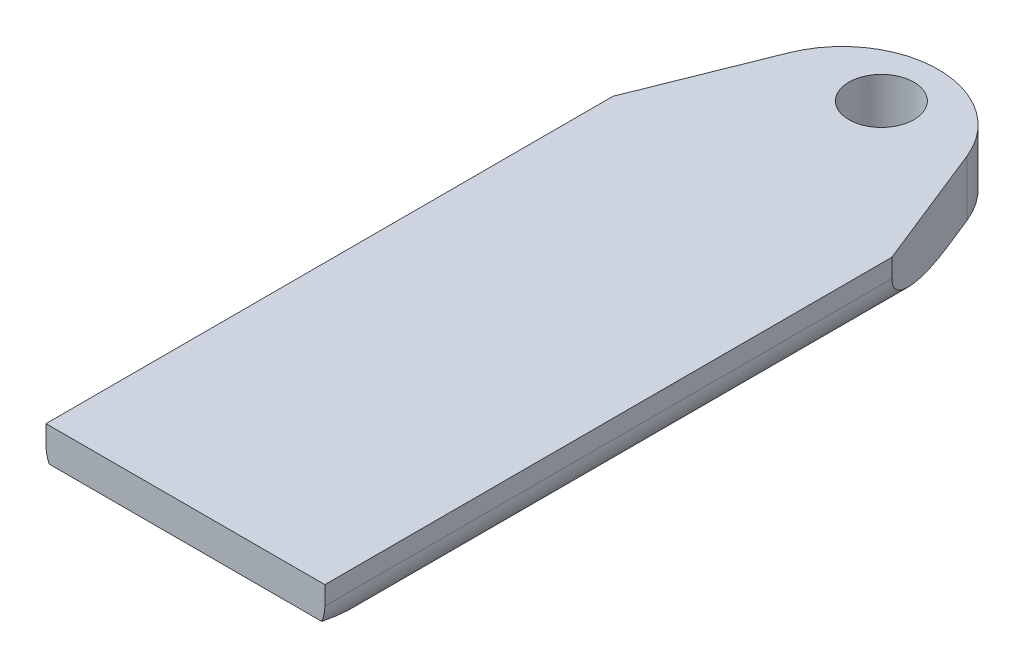
ISO-10303-21;
HEADER;
FILE_DESCRIPTION(('STEP AP214'),'2;1');
FILE_NAME('part.step','',(''),(''),'','','');
FILE_SCHEMA(('AUTOMOTIVE_DESIGN { 1 0 10303 214 1 1 1 1 }'));
ENDSEC;
DATA;
#1=APPLICATION_CONTEXT('core data for automotive mechanical design processes');
#2=APPLICATION_PROTOCOL_DEFINITION('international standard','automotive_design',2000,#1);
#3=PRODUCT_CONTEXT('',#1,'mechanical');
#4=PRODUCT('Part','Part','',(#3));
#5=PRODUCT_RELATED_PRODUCT_CATEGORY('part','',(#4));
#6=PRODUCT_DEFINITION_FORMATION('','',#4);
#7=PRODUCT_DEFINITION_CONTEXT('part definition',#1,'design');
#8=PRODUCT_DEFINITION('design','',#6,#7);
#9=PRODUCT_DEFINITION_SHAPE('','',#8);
#10=(LENGTH_UNIT() NAMED_UNIT(*) SI_UNIT(.MILLI.,.METRE.));
#11=(NAMED_UNIT(*) PLANE_ANGLE_UNIT() SI_UNIT($,.RADIAN.));
#12=(NAMED_UNIT(*) SI_UNIT($,.STERADIAN.) SOLID_ANGLE_UNIT());
#13=UNCERTAINTY_MEASURE_WITH_UNIT(LENGTH_MEASURE(1.E-05),#10,'distance_accuracy_value','');
#14=(GEOMETRIC_REPRESENTATION_CONTEXT(3) GLOBAL_UNCERTAINTY_ASSIGNED_CONTEXT((#13)) GLOBAL_UNIT_ASSIGNED_CONTEXT((#10,
#11,#12)) REPRESENTATION_CONTEXT('',''));
#15=CARTESIAN_POINT('',(0.,0.,0.));
#16=DIRECTION('',(0.,0.,1.));
#17=DIRECTION('',(1.,0.,0.));
#18=AXIS2_PLACEMENT_3D('',#15,#16,#17);
#19=CARTESIAN_POINT('',(0.,110.,-35.3303846350059));
#20=DIRECTION('',(0.,1.,0.));
#21=DIRECTION('',(0.,0.,1.));
#22=AXIS2_PLACEMENT_3D('',#19,#20,#21);
#23=CYLINDRICAL_SURFACE('',#22,5.16961536499412);
#24=DIRECTION('',(0.,-1.,0.));
#25=VECTOR('',#24,1.);
#26=CARTESIAN_POINT('',(-4.79986736723934,107.,-37.2503315819016));
#27=LINE('',#26,#25);
#28=CARTESIAN_POINT('',(-4.79986736723934,110.,-37.2503315819016));
#29=VERTEX_POINT('',#28);
#30=CARTESIAN_POINT('',(-4.79986736723934,107.,-37.2503315819016));
#31=VERTEX_POINT('',#30);
#32=EDGE_CURVE('E176',#29,#31,#27,.T.);
#33=ORIENTED_EDGE('',*,*,#32,.F.);
#34=CARTESIAN_POINT('',(0.,110.,-35.3303846350059));
#35=DIRECTION('',(0.,1.,0.));
#36=DIRECTION('',(0.,0.,1.));
#37=AXIS2_PLACEMENT_3D('',#34,#35,#36);
#38=CIRCLE('',#37,5.16961536499412);
#39=CARTESIAN_POINT('',(4.79986736723935,110.,-37.2503315819016));
#40=VERTEX_POINT('',#39);
#41=EDGE_CURVE('E47',#40,#29,#38,.T.);
#42=ORIENTED_EDGE('',*,*,#41,.F.);
#43=DIRECTION('',(0.,-1.,0.));
#44=VECTOR('',#43,1.);
#45=CARTESIAN_POINT('',(4.79986736723935,107.,-37.2503315819016));
#46=LINE('',#45,#44);
#47=CARTESIAN_POINT('',(4.79986736723935,107.,-37.2503315819016));
#48=VERTEX_POINT('',#47);
#49=EDGE_CURVE('E179',#48,#40,#46,.F.);
#50=ORIENTED_EDGE('',*,*,#49,.F.);
#51=CARTESIAN_POINT('',(0.,107.,-35.3303846350059));
#52=DIRECTION('',(0.,-1.,0.));
#53=DIRECTION('',(0.,0.,-1.));
#54=AXIS2_PLACEMENT_3D('',#51,#52,#53);
#55=CIRCLE('',#54,5.16961536499412);
#56=EDGE_CURVE('E13',#31,#48,#55,.T.);
#57=ORIENTED_EDGE('',*,*,#56,.F.);
#58=EDGE_LOOP('',(#33,#42,#50,#57));
#59=FACE_BOUND('',#58,.T.);
#60=ADVANCED_FACE('F39',(#59),#23,.T.);
#61=CARTESIAN_POINT('',(-7.49999999999999,107.,-40.5));
#62=DIRECTION('',(-1.,0.,0.));
#63=DIRECTION('',(0.,0.,1.));
#64=AXIS2_PLACEMENT_3D('',#61,#62,#63);
#65=PLANE('',#64);
#66=DIRECTION('',(0.,-1.,0.));
#67=VECTOR('',#66,1.);
#68=CARTESIAN_POINT('',(-7.49999999999999,107.,-30.4999999999999));
#69=LINE('',#68,#67);
#70=CARTESIAN_POINT('',(-7.49999999999999,110.,-30.4999999999999));
#71=VERTEX_POINT('',#70);
#72=CARTESIAN_POINT('',(-7.49999999999999,109.,-30.4999999999999));
#73=VERTEX_POINT('',#72);
#74=EDGE_CURVE('E142',#71,#73,#69,.T.);
#75=ORIENTED_EDGE('',*,*,#74,.T.);
#76=DIRECTION('',(0.,0.,1.));
#77=VECTOR('',#76,1.);
#78=CARTESIAN_POINT('',(-7.49999999999999,109.,-40.5));
#79=LINE('',#78,#77);
#80=CARTESIAN_POINT('',(-7.49999999999999,109.,0.));
#81=VERTEX_POINT('',#80);
#82=EDGE_CURVE('E154',#73,#81,#79,.T.);
#83=ORIENTED_EDGE('',*,*,#82,.T.);
#84=DIRECTION('',(0.,-1.,0.));
#85=VECTOR('',#84,1.);
#86=CARTESIAN_POINT('',(-7.49999999999999,107.,0.));
#87=LINE('',#86,#85);
#88=CARTESIAN_POINT('',(-7.49999999999999,110.,0.));
#89=VERTEX_POINT('',#88);
#90=EDGE_CURVE('E118',#89,#81,#87,.T.);
#91=ORIENTED_EDGE('',*,*,#90,.F.);
#92=DIRECTION('',(0.,0.,1.));
#93=VECTOR('',#92,1.);
#94=CARTESIAN_POINT('',(-7.49999999999999,110.,-40.5));
#95=LINE('',#94,#93);
#96=EDGE_CURVE('E128',#71,#89,#95,.T.);
#97=ORIENTED_EDGE('',*,*,#96,.F.);
#98=EDGE_LOOP('',(#75,#83,#91,#97));
#99=FACE_BOUND('',#98,.T.);
#100=ADVANCED_FACE('F188',(#99),#65,.T.);
#101=CARTESIAN_POINT('',(-7.49999999999999,110.,-40.5));
#102=DIRECTION('',(0.,1.,0.));
#103=DIRECTION('',(0.,0.,1.));
#104=AXIS2_PLACEMENT_3D('',#101,#102,#103);
#105=PLANE('',#104);
#106=CARTESIAN_POINT('',(-0.0655498861733732,110.,-37.5));
#107=DIRECTION('',(0.,1.,0.));
#108=DIRECTION('',(0.,0.,1.));
#109=AXIS2_PLACEMENT_3D('',#106,#107,#108);
#110=CIRCLE('',#109,1.75);
#111=CARTESIAN_POINT('',(-0.0655498861733732,110.,-35.75));
#112=VERTEX_POINT('',#111);
#113=EDGE_CURVE('E249',#112,#112,#110,.T.);
#114=ORIENTED_EDGE('',*,*,#113,.F.);
#115=EDGE_LOOP('',(#114));
#116=FACE_BOUND('',#115,.T.);
#117=DIRECTION('',(0.371390676354101,0.,0.92847669088526));
#118=VECTOR('',#117,1.);
#119=CARTESIAN_POINT('',(1.98275862068967,110.,-44.2931034482758));
#120=LINE('',#119,#118);
#121=CARTESIAN_POINT('',(7.50000000000001,110.,-30.4999999999999));
#122=VERTEX_POINT('',#121);
#123=EDGE_CURVE('E149',#122,#40,#120,.F.);
#124=ORIENTED_EDGE('',*,*,#123,.T.);
#125=ORIENTED_EDGE('',*,*,#41,.T.);
#126=DIRECTION('',(0.371390676354101,0.,-0.92847669088526));
#127=VECTOR('',#126,1.);
#128=CARTESIAN_POINT('',(-4.05172413793102,110.,-39.1206896551724));
#129=LINE('',#128,#127);
#130=EDGE_CURVE('E151',#29,#71,#129,.F.);
#131=ORIENTED_EDGE('',*,*,#130,.T.);
#132=ORIENTED_EDGE('',*,*,#96,.T.);
#133=DIRECTION('',(-1.,0.,0.));
#134=VECTOR('',#133,1.);
#135=CARTESIAN_POINT('',(-7.49999999999999,110.,0.));
#136=LINE('',#135,#134);
#137=CARTESIAN_POINT('',(7.50000000000001,110.,0.));
#138=VERTEX_POINT('',#137);
#139=EDGE_CURVE('E112',#138,#89,#136,.T.);
#140=ORIENTED_EDGE('',*,*,#139,.F.);
#141=DIRECTION('',(0.,0.,1.));
#142=VECTOR('',#141,1.);
#143=CARTESIAN_POINT('',(7.50000000000001,110.,-40.5));
#144=LINE('',#143,#142);
#145=EDGE_CURVE('E121',#122,#138,#144,.T.);
#146=ORIENTED_EDGE('',*,*,#145,.F.);
#147=EDGE_LOOP('',(#124,#125,#131,#132,#140,#146));
#148=FACE_BOUND('',#147,.T.);
#149=ADVANCED_FACE('F130',(#116,#148),#105,.T.);
#150=CARTESIAN_POINT('',(7.50000000000001,107.,-40.5));
#151=DIRECTION('',(1.,0.,0.));
#152=DIRECTION('',(0.,0.,-1.));
#153=AXIS2_PLACEMENT_3D('',#150,#151,#152);
#154=PLANE('',#153);
#155=DIRECTION('',(0.,1.,0.));
#156=VECTOR('',#155,1.);
#157=CARTESIAN_POINT('',(7.50000000000001,107.,0.));
#158=LINE('',#157,#156);
#159=CARTESIAN_POINT('',(7.50000000000001,109.,0.));
#160=VERTEX_POINT('',#159);
#161=EDGE_CURVE('E107',#160,#138,#158,.T.);
#162=ORIENTED_EDGE('',*,*,#161,.F.);
#163=DIRECTION('',(0.,0.,1.));
#164=VECTOR('',#163,1.);
#165=CARTESIAN_POINT('',(7.50000000000001,109.,-40.5));
#166=LINE('',#165,#164);
#167=CARTESIAN_POINT('',(7.50000000000001,109.,-30.4999999999999));
#168=VERTEX_POINT('',#167);
#169=EDGE_CURVE('E171',#160,#168,#166,.F.);
#170=ORIENTED_EDGE('',*,*,#169,.T.);
#171=DIRECTION('',(0.,1.,0.));
#172=VECTOR('',#171,1.);
#173=CARTESIAN_POINT('',(7.50000000000001,107.,-30.4999999999999));
#174=LINE('',#173,#172);
#175=EDGE_CURVE('E124',#168,#122,#174,.T.);
#176=ORIENTED_EDGE('',*,*,#175,.T.);
#177=ORIENTED_EDGE('',*,*,#145,.T.);
#178=EDGE_LOOP('',(#162,#170,#176,#177));
#179=FACE_BOUND('',#178,.T.);
#180=ADVANCED_FACE('F122',(#179),#154,.T.);
#181=CARTESIAN_POINT('',(-7.49999999999999,107.,-40.5));
#182=DIRECTION('',(0.,-1.,0.));
#183=DIRECTION('',(0.,0.,-1.));
#184=AXIS2_PLACEMENT_3D('',#181,#182,#183);
#185=PLANE('',#184);
#186=CARTESIAN_POINT('',(-0.0655498861733732,107.,-37.5));
#187=DIRECTION('',(0.,-1.,0.));
#188=DIRECTION('',(0.,0.,-1.));
#189=AXIS2_PLACEMENT_3D('',#186,#187,#188);
#190=CIRCLE('',#189,1.75);
#191=CARTESIAN_POINT('',(-0.0655498861733732,107.,-39.25));
#192=VERTEX_POINT('',#191);
#193=EDGE_CURVE('E248',#192,#192,#190,.T.);
#194=ORIENTED_EDGE('',*,*,#193,.F.);
#195=EDGE_LOOP('',(#194));
#196=FACE_BOUND('',#195,.T.);
#197=DIRECTION('',(-0.371390676354101,0.,0.92847669088526));
#198=VECTOR('',#197,1.);
#199=CARTESIAN_POINT('',(-4.05172413793102,107.,-39.1206896551724));
#200=LINE('',#199,#198);
#201=CARTESIAN_POINT('',(-5.49999999999999,107.,-35.4999999999999));
#202=VERTEX_POINT('',#201);
#203=EDGE_CURVE('E147',#202,#31,#200,.F.);
#204=ORIENTED_EDGE('',*,*,#203,.T.);
#205=ORIENTED_EDGE('',*,*,#56,.T.);
#206=DIRECTION('',(-0.371390676354101,0.,-0.92847669088526));
#207=VECTOR('',#206,1.);
#208=CARTESIAN_POINT('',(1.98275862068967,107.,-44.2931034482758));
#209=LINE('',#208,#207);
#210=CARTESIAN_POINT('',(5.50000000000001,107.,-35.5));
#211=VERTEX_POINT('',#210);
#212=EDGE_CURVE('E145',#48,#211,#209,.F.);
#213=ORIENTED_EDGE('',*,*,#212,.T.);
#214=DIRECTION('',(0.,0.,1.));
#215=VECTOR('',#214,1.);
#216=CARTESIAN_POINT('',(5.50000000000001,107.,-40.5));
#217=LINE('',#216,#215);
#218=CARTESIAN_POINT('',(5.50000000000001,107.,-4.00000000000004));
#219=VERTEX_POINT('',#218);
#220=EDGE_CURVE('E164',#211,#219,#217,.T.);
#221=ORIENTED_EDGE('',*,*,#220,.T.);
#222=DIRECTION('',(-1.,0.,0.));
#223=VECTOR('',#222,1.);
#224=CARTESIAN_POINT('',(-7.49999999999999,107.,-4.00000000000004));
#225=LINE('',#224,#223);
#226=CARTESIAN_POINT('',(-5.49999999999999,107.,-4.00000000000004));
#227=VERTEX_POINT('',#226);
#228=EDGE_CURVE('E139',#219,#227,#225,.T.);
#229=ORIENTED_EDGE('',*,*,#228,.T.);
#230=DIRECTION('',(0.,0.,1.));
#231=VECTOR('',#230,1.);
#232=CARTESIAN_POINT('',(-5.49999999999999,107.,-40.5));
#233=LINE('',#232,#231);
#234=EDGE_CURVE('E167',#227,#202,#233,.F.);
#235=ORIENTED_EDGE('',*,*,#234,.T.);
#236=EDGE_LOOP('',(#204,#205,#213,#221,#229,#235));
#237=FACE_BOUND('',#236,.T.);
#238=ADVANCED_FACE('F201',(#196,#237),#185,.T.);
#239=CARTESIAN_POINT('',(0.,0.,0.));
#240=DIRECTION('',(0.,0.,-1.));
#241=DIRECTION('',(-1.,0.,0.));
#242=AXIS2_PLACEMENT_3D('',#239,#240,#241);
#243=PLANE('',#242);
#244=ORIENTED_EDGE('',*,*,#90,.T.);
#245=CARTESIAN_POINT('',(-5.49999999999999,109.,0.));
#246=DIRECTION('',(0.,0.,-1.));
#247=DIRECTION('',(-1.,0.,0.));
#248=AXIS2_PLACEMENT_3D('',#245,#246,#247);
#249=CIRCLE('',#248,2.);
#250=CARTESIAN_POINT('',(-7.33303027798233,108.2,0.));
#251=VERTEX_POINT('',#250);
#252=EDGE_CURVE('E158',#81,#251,#249,.F.);
#253=ORIENTED_EDGE('',*,*,#252,.T.);
#254=DIRECTION('',(1.,0.,0.));
#255=VECTOR('',#254,1.);
#256=CARTESIAN_POINT('',(7.50000000000001,108.2,0.));
#257=LINE('',#256,#255);
#258=CARTESIAN_POINT('',(7.33303027798234,108.2,0.));
#259=VERTEX_POINT('',#258);
#260=EDGE_CURVE('E136',#251,#259,#257,.T.);
#261=ORIENTED_EDGE('',*,*,#260,.T.);
#262=CARTESIAN_POINT('',(5.50000000000001,109.,0.));
#263=DIRECTION('',(0.,0.,-1.));
#264=DIRECTION('',(-1.,0.,0.));
#265=AXIS2_PLACEMENT_3D('',#262,#263,#264);
#266=CIRCLE('',#265,2.);
#267=EDGE_CURVE('E115',#259,#160,#266,.F.);
#268=ORIENTED_EDGE('',*,*,#267,.T.);
#269=ORIENTED_EDGE('',*,*,#161,.T.);
#270=ORIENTED_EDGE('',*,*,#139,.T.);
#271=EDGE_LOOP('',(#244,#253,#261,#268,#269,#270));
#272=FACE_BOUND('',#271,.T.);
#273=ADVANCED_FACE('F110',(#272),#243,.F.);
#274=CARTESIAN_POINT('',(-0.0655498861733732,147.5,-37.5));
#275=DIRECTION('',(0.,-1.,0.));
#276=DIRECTION('',(0.,0.,-1.));
#277=AXIS2_PLACEMENT_3D('',#274,#275,#276);
#278=CYLINDRICAL_SURFACE('',#277,1.75);
#279=ORIENTED_EDGE('',*,*,#113,.T.);
#280=EDGE_LOOP('',(#279));
#281=FACE_BOUND('',#280,.T.);
#282=ORIENTED_EDGE('',*,*,#193,.T.);
#283=EDGE_LOOP('',(#282));
#284=FACE_BOUND('',#283,.T.);
#285=ADVANCED_FACE('F227',(#281,#284),#278,.F.);
#286=CARTESIAN_POINT('',(0.,108.2,0.));
#287=DIRECTION('',(0.,-0.957826285221152,0.287347885566344));
#288=DIRECTION('',(-1.,0.,0.));
#289=AXIS2_PLACEMENT_3D('',#286,#287,#288);
#290=PLANE('',#289);
#291=ORIENTED_EDGE('',*,*,#260,.F.);
#292=CARTESIAN_POINT('',(-5.49999999999999,109.,2.66666666666666));
#293=DIRECTION('',(0.,-0.957826285221152,0.287347885566344));
#294=DIRECTION('',(0.,0.287347885566344,0.957826285221152));
#295=AXIS2_PLACEMENT_3D('',#292,#293,#294);
#296=ELLIPSE('',#295,6.96020433927373,2.);
#297=EDGE_CURVE('E162',#251,#227,#296,.T.);
#298=ORIENTED_EDGE('',*,*,#297,.T.);
#299=ORIENTED_EDGE('',*,*,#228,.F.);
#300=CARTESIAN_POINT('',(5.50000000000001,109.,2.66666666666666));
#301=DIRECTION('',(0.,-0.957826285221152,0.287347885566344));
#302=DIRECTION('',(0.,0.287347885566344,0.957826285221152));
#303=AXIS2_PLACEMENT_3D('',#300,#301,#302);
#304=ELLIPSE('',#303,6.96020433927373,2.);
#305=EDGE_CURVE('E160',#219,#259,#304,.T.);
#306=ORIENTED_EDGE('',*,*,#305,.T.);
#307=EDGE_LOOP('',(#291,#298,#299,#306));
#308=FACE_BOUND('',#307,.T.);
#309=ADVANCED_FACE('F195',(#308),#290,.T.);
#310=CARTESIAN_POINT('',(-7.49999999999999,107.,-30.4999999999999));
#311=DIRECTION('',(0.92847669088526,0.,0.371390676354101));
#312=DIRECTION('',(0.,-1.,0.));
#313=AXIS2_PLACEMENT_3D('',#310,#311,#312);
#314=PLANE('',#313);
#315=ORIENTED_EDGE('',*,*,#130,.F.);
#316=ORIENTED_EDGE('',*,*,#32,.T.);
#317=ORIENTED_EDGE('',*,*,#203,.F.);
#318=CARTESIAN_POINT('',(-5.49999999999999,109.,-35.5));
#319=DIRECTION('',(0.92847669088526,0.,0.371390676354101));
#320=DIRECTION('',(-0.371390676354101,0.,0.92847669088526));
#321=AXIS2_PLACEMENT_3D('',#318,#319,#320);
#322=ELLIPSE('',#321,5.38516480713454,2.);
#323=EDGE_CURVE('E169',#202,#73,#322,.F.);
#324=ORIENTED_EDGE('',*,*,#323,.T.);
#325=ORIENTED_EDGE('',*,*,#74,.F.);
#326=EDGE_LOOP('',(#315,#316,#317,#324,#325));
#327=FACE_BOUND('',#326,.T.);
#328=ADVANCED_FACE('F184',(#327),#314,.F.);
#329=CARTESIAN_POINT('',(7.50000000000001,107.,-30.4999999999999));
#330=DIRECTION('',(-0.92847669088526,0.,0.371390676354101));
#331=DIRECTION('',(0.,1.,0.));
#332=AXIS2_PLACEMENT_3D('',#329,#330,#331);
#333=PLANE('',#332);
#334=ORIENTED_EDGE('',*,*,#212,.F.);
#335=ORIENTED_EDGE('',*,*,#49,.T.);
#336=ORIENTED_EDGE('',*,*,#123,.F.);
#337=ORIENTED_EDGE('',*,*,#175,.F.);
#338=CARTESIAN_POINT('',(5.50000000000001,109.,-35.5));
#339=DIRECTION('',(-0.92847669088526,0.,0.371390676354101));
#340=DIRECTION('',(0.371390676354101,0.,0.92847669088526));
#341=AXIS2_PLACEMENT_3D('',#338,#339,#340);
#342=ELLIPSE('',#341,5.38516480713454,2.);
#343=EDGE_CURVE('E173',#168,#211,#342,.F.);
#344=ORIENTED_EDGE('',*,*,#343,.T.);
#345=EDGE_LOOP('',(#334,#335,#336,#337,#344));
#346=FACE_BOUND('',#345,.T.);
#347=ADVANCED_FACE('F204',(#346),#333,.F.);
#348=CARTESIAN_POINT('',(-5.49999999999999,109.,-40.5));
#349=DIRECTION('',(0.,0.,1.));
#350=DIRECTION('',(1.,0.,0.));
#351=AXIS2_PLACEMENT_3D('',#348,#349,#350);
#352=CYLINDRICAL_SURFACE('',#351,2.);
#353=ORIENTED_EDGE('',*,*,#323,.F.);
#354=ORIENTED_EDGE('',*,*,#234,.F.);
#355=ORIENTED_EDGE('',*,*,#297,.F.);
#356=ORIENTED_EDGE('',*,*,#252,.F.);
#357=ORIENTED_EDGE('',*,*,#82,.F.);
#358=EDGE_LOOP('',(#353,#354,#355,#356,#357));
#359=FACE_BOUND('',#358,.T.);
#360=ADVANCED_FACE('F190',(#359),#352,.T.);
#361=CARTESIAN_POINT('',(5.50000000000001,109.,-40.5));
#362=DIRECTION('',(0.,0.,1.));
#363=DIRECTION('',(1.,0.,0.));
#364=AXIS2_PLACEMENT_3D('',#361,#362,#363);
#365=CYLINDRICAL_SURFACE('',#364,2.);
#366=ORIENTED_EDGE('',*,*,#343,.F.);
#367=ORIENTED_EDGE('',*,*,#169,.F.);
#368=ORIENTED_EDGE('',*,*,#267,.F.);
#369=ORIENTED_EDGE('',*,*,#305,.F.);
#370=ORIENTED_EDGE('',*,*,#220,.F.);
#371=EDGE_LOOP('',(#366,#367,#368,#369,#370));
#372=FACE_BOUND('',#371,.T.);
#373=ADVANCED_FACE('F200',(#372),#365,.T.);
#374=CLOSED_SHELL('',(#60,#100,#149,#180,#238,#273,#285,#309,#328,#347,#360,#373));
#375=MANIFOLD_SOLID_BREP('B2',#374);
#376=ADVANCED_BREP_SHAPE_REPRESENTATION('',(#18,#375),#14);
#377=SHAPE_DEFINITION_REPRESENTATION(#9,#376);
ENDSEC;
END-ISO-10303-21;
